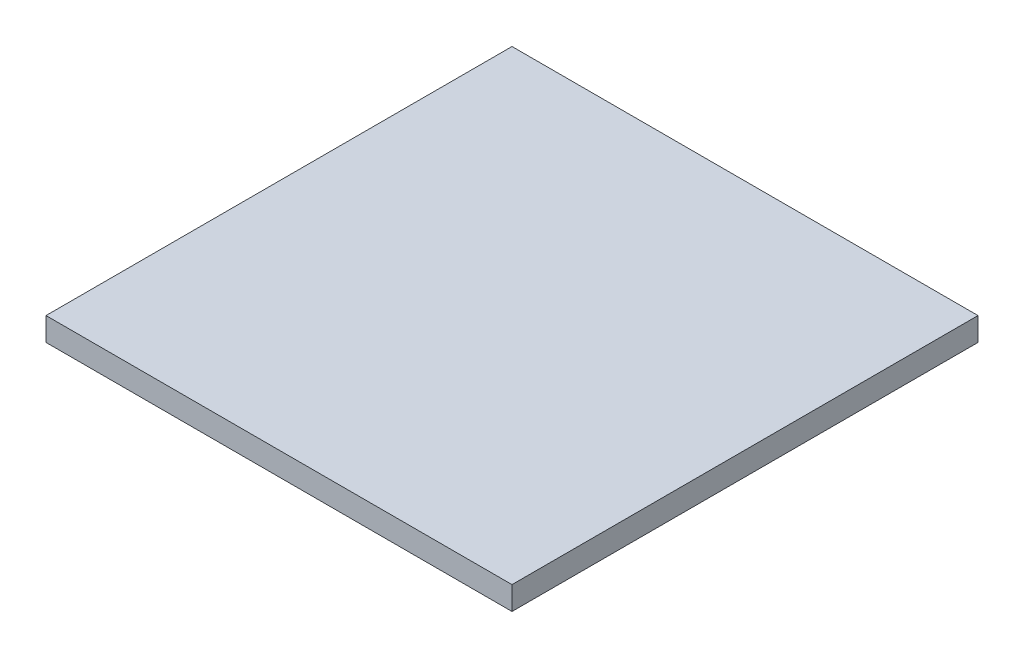
ISO-10303-21;
HEADER;
FILE_DESCRIPTION(('STEP AP214'),'2;1');
FILE_NAME('part.step','',(''),(''),'','','');
FILE_SCHEMA(('AUTOMOTIVE_DESIGN { 1 0 10303 214 1 1 1 1 }'));
ENDSEC;
DATA;
#1=APPLICATION_CONTEXT('core data for automotive mechanical design processes');
#2=APPLICATION_PROTOCOL_DEFINITION('international standard','automotive_design',2000,#1);
#3=PRODUCT_CONTEXT('',#1,'mechanical');
#4=PRODUCT('Part','Part','',(#3));
#5=PRODUCT_RELATED_PRODUCT_CATEGORY('part','',(#4));
#6=PRODUCT_DEFINITION_FORMATION('','',#4);
#7=PRODUCT_DEFINITION_CONTEXT('part definition',#1,'design');
#8=PRODUCT_DEFINITION('design','',#6,#7);
#9=PRODUCT_DEFINITION_SHAPE('','',#8);
#10=(LENGTH_UNIT() NAMED_UNIT(*) SI_UNIT(.MILLI.,.METRE.));
#11=(NAMED_UNIT(*) PLANE_ANGLE_UNIT() SI_UNIT($,.RADIAN.));
#12=(NAMED_UNIT(*) SI_UNIT($,.STERADIAN.) SOLID_ANGLE_UNIT());
#13=UNCERTAINTY_MEASURE_WITH_UNIT(LENGTH_MEASURE(1.E-05),#10,'distance_accuracy_value','');
#14=(GEOMETRIC_REPRESENTATION_CONTEXT(3) GLOBAL_UNCERTAINTY_ASSIGNED_CONTEXT((#13)) GLOBAL_UNIT_ASSIGNED_CONTEXT((#10,
#11,#12)) REPRESENTATION_CONTEXT('',''));
#15=CARTESIAN_POINT('',(0.,0.,0.));
#16=DIRECTION('',(0.,0.,1.));
#17=DIRECTION('',(1.,0.,0.));
#18=AXIS2_PLACEMENT_3D('',#15,#16,#17);
#19=CARTESIAN_POINT('',(-250.,25.,250.));
#20=DIRECTION('',(1.,0.,0.));
#21=DIRECTION('',(0.,0.,-1.));
#22=AXIS2_PLACEMENT_3D('',#19,#20,#21);
#23=PLANE('',#22);
#24=DIRECTION('',(0.,0.,1.));
#25=VECTOR('',#24,1.);
#26=CARTESIAN_POINT('',(-250.,0.,250.));
#27=LINE('',#26,#25);
#28=CARTESIAN_POINT('',(-250.,0.,-250.));
#29=VERTEX_POINT('',#28);
#30=CARTESIAN_POINT('',(-250.,0.,250.));
#31=VERTEX_POINT('',#30);
#32=EDGE_CURVE('E107',#29,#31,#27,.T.);
#33=ORIENTED_EDGE('',*,*,#32,.T.);
#34=DIRECTION('',(0.,-1.,0.));
#35=VECTOR('',#34,1.);
#36=CARTESIAN_POINT('',(-250.,25.,250.));
#37=LINE('',#36,#35);
#38=CARTESIAN_POINT('',(-250.,25.,250.));
#39=VERTEX_POINT('',#38);
#40=EDGE_CURVE('E11',#39,#31,#37,.T.);
#41=ORIENTED_EDGE('',*,*,#40,.F.);
#42=DIRECTION('',(0.,0.,1.));
#43=VECTOR('',#42,1.);
#44=CARTESIAN_POINT('',(-250.,25.,250.));
#45=LINE('',#44,#43);
#46=CARTESIAN_POINT('',(-250.,25.,-250.));
#47=VERTEX_POINT('',#46);
#48=EDGE_CURVE('E91',#47,#39,#45,.T.);
#49=ORIENTED_EDGE('',*,*,#48,.F.);
#50=DIRECTION('',(0.,-1.,0.));
#51=VECTOR('',#50,1.);
#52=CARTESIAN_POINT('',(-250.,25.,-250.));
#53=LINE('',#52,#51);
#54=EDGE_CURVE('E103',#47,#29,#53,.T.);
#55=ORIENTED_EDGE('',*,*,#54,.T.);
#56=EDGE_LOOP('',(#33,#41,#49,#55));
#57=FACE_BOUND('',#56,.T.);
#58=ADVANCED_FACE('F39',(#57),#23,.F.);
#59=CARTESIAN_POINT('',(-250.,25.,250.));
#60=DIRECTION('',(0.,0.,-1.));
#61=DIRECTION('',(-1.,0.,0.));
#62=AXIS2_PLACEMENT_3D('',#59,#60,#61);
#63=PLANE('',#62);
#64=DIRECTION('',(1.,0.,0.));
#65=VECTOR('',#64,1.);
#66=CARTESIAN_POINT('',(-250.,0.,250.));
#67=LINE('',#66,#65);
#68=CARTESIAN_POINT('',(250.,0.,250.));
#69=VERTEX_POINT('',#68);
#70=EDGE_CURVE('E96',#31,#69,#67,.T.);
#71=ORIENTED_EDGE('',*,*,#70,.T.);
#72=DIRECTION('',(0.,-1.,0.));
#73=VECTOR('',#72,1.);
#74=CARTESIAN_POINT('',(250.,25.,250.));
#75=LINE('',#74,#73);
#76=CARTESIAN_POINT('',(250.,25.,250.));
#77=VERTEX_POINT('',#76);
#78=EDGE_CURVE('E48',#77,#69,#75,.T.);
#79=ORIENTED_EDGE('',*,*,#78,.F.);
#80=DIRECTION('',(1.,0.,0.));
#81=VECTOR('',#80,1.);
#82=CARTESIAN_POINT('',(-250.,25.,250.));
#83=LINE('',#82,#81);
#84=EDGE_CURVE('E86',#39,#77,#83,.T.);
#85=ORIENTED_EDGE('',*,*,#84,.F.);
#86=ORIENTED_EDGE('',*,*,#40,.T.);
#87=EDGE_LOOP('',(#71,#79,#85,#86));
#88=FACE_BOUND('',#87,.T.);
#89=ADVANCED_FACE('F95',(#88),#63,.F.);
#90=CARTESIAN_POINT('',(250.,25.,250.));
#91=DIRECTION('',(-1.,0.,0.));
#92=DIRECTION('',(0.,0.,1.));
#93=AXIS2_PLACEMENT_3D('',#90,#91,#92);
#94=PLANE('',#93);
#95=DIRECTION('',(0.,0.,-1.));
#96=VECTOR('',#95,1.);
#97=CARTESIAN_POINT('',(250.,0.,250.));
#98=LINE('',#97,#96);
#99=CARTESIAN_POINT('',(250.,0.,-250.));
#100=VERTEX_POINT('',#99);
#101=EDGE_CURVE('E73',#69,#100,#98,.T.);
#102=ORIENTED_EDGE('',*,*,#101,.T.);
#103=DIRECTION('',(0.,-1.,0.));
#104=VECTOR('',#103,1.);
#105=CARTESIAN_POINT('',(250.,25.,-250.));
#106=LINE('',#105,#104);
#107=CARTESIAN_POINT('',(250.,25.,-250.));
#108=VERTEX_POINT('',#107);
#109=EDGE_CURVE('E98',#108,#100,#106,.T.);
#110=ORIENTED_EDGE('',*,*,#109,.F.);
#111=DIRECTION('',(0.,0.,-1.));
#112=VECTOR('',#111,1.);
#113=CARTESIAN_POINT('',(250.,25.,250.));
#114=LINE('',#113,#112);
#115=EDGE_CURVE('E89',#77,#108,#114,.T.);
#116=ORIENTED_EDGE('',*,*,#115,.F.);
#117=ORIENTED_EDGE('',*,*,#78,.T.);
#118=EDGE_LOOP('',(#102,#110,#116,#117));
#119=FACE_BOUND('',#118,.T.);
#120=ADVANCED_FACE('F99',(#119),#94,.F.);
#121=CARTESIAN_POINT('',(-250.,25.,-250.));
#122=DIRECTION('',(0.,0.,1.));
#123=DIRECTION('',(1.,0.,0.));
#124=AXIS2_PLACEMENT_3D('',#121,#122,#123);
#125=PLANE('',#124);
#126=DIRECTION('',(-1.,0.,0.));
#127=VECTOR('',#126,1.);
#128=CARTESIAN_POINT('',(-250.,0.,-250.));
#129=LINE('',#128,#127);
#130=EDGE_CURVE('E79',#100,#29,#129,.T.);
#131=ORIENTED_EDGE('',*,*,#130,.T.);
#132=ORIENTED_EDGE('',*,*,#54,.F.);
#133=DIRECTION('',(-1.,0.,0.));
#134=VECTOR('',#133,1.);
#135=CARTESIAN_POINT('',(-250.,25.,-250.));
#136=LINE('',#135,#134);
#137=EDGE_CURVE('E56',#108,#47,#136,.T.);
#138=ORIENTED_EDGE('',*,*,#137,.F.);
#139=ORIENTED_EDGE('',*,*,#109,.T.);
#140=EDGE_LOOP('',(#131,#132,#138,#139));
#141=FACE_BOUND('',#140,.T.);
#142=ADVANCED_FACE('F120',(#141),#125,.F.);
#143=CARTESIAN_POINT('',(0.,25.,0.));
#144=DIRECTION('',(0.,-1.,0.));
#145=DIRECTION('',(0.,0.,-1.));
#146=AXIS2_PLACEMENT_3D('',#143,#144,#145);
#147=PLANE('',#146);
#148=ORIENTED_EDGE('',*,*,#48,.T.);
#149=ORIENTED_EDGE('',*,*,#84,.T.);
#150=ORIENTED_EDGE('',*,*,#115,.T.);
#151=ORIENTED_EDGE('',*,*,#137,.T.);
#152=EDGE_LOOP('',(#148,#149,#150,#151));
#153=FACE_BOUND('',#152,.T.);
#154=ADVANCED_FACE('F87',(#153),#147,.F.);
#155=CARTESIAN_POINT('',(0.,0.,0.));
#156=DIRECTION('',(0.,-1.,0.));
#157=DIRECTION('',(0.,0.,-1.));
#158=AXIS2_PLACEMENT_3D('',#155,#156,#157);
#159=PLANE('',#158);
#160=ORIENTED_EDGE('',*,*,#32,.F.);
#161=ORIENTED_EDGE('',*,*,#130,.F.);
#162=ORIENTED_EDGE('',*,*,#101,.F.);
#163=ORIENTED_EDGE('',*,*,#70,.F.);
#164=EDGE_LOOP('',(#160,#161,#162,#163));
#165=FACE_BOUND('',#164,.T.);
#166=ADVANCED_FACE('F123',(#165),#159,.T.);
#167=CLOSED_SHELL('',(#58,#89,#120,#142,#154,#166));
#168=MANIFOLD_SOLID_BREP('B2',#167);
#169=ADVANCED_BREP_SHAPE_REPRESENTATION('',(#18,#168),#14);
#170=SHAPE_DEFINITION_REPRESENTATION(#9,#169);
ENDSEC;
END-ISO-10303-21;
